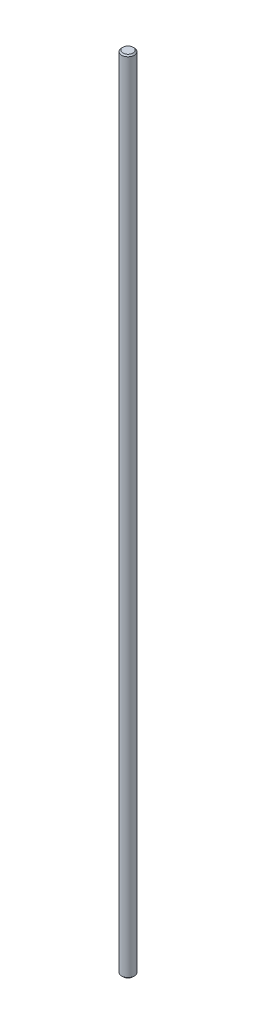
ISO-10303-21;
HEADER;
FILE_DESCRIPTION(('STEP AP214'),'2;1');
FILE_NAME('part.step','',(''),(''),'','','');
FILE_SCHEMA(('AUTOMOTIVE_DESIGN { 1 0 10303 214 1 1 1 1 }'));
ENDSEC;
DATA;
#1=APPLICATION_CONTEXT('core data for automotive mechanical design processes');
#2=APPLICATION_PROTOCOL_DEFINITION('international standard','automotive_design',2000,#1);
#3=PRODUCT_CONTEXT('',#1,'mechanical');
#4=PRODUCT('Part','Part','',(#3));
#5=PRODUCT_RELATED_PRODUCT_CATEGORY('part','',(#4));
#6=PRODUCT_DEFINITION_FORMATION('','',#4);
#7=PRODUCT_DEFINITION_CONTEXT('part definition',#1,'design');
#8=PRODUCT_DEFINITION('design','',#6,#7);
#9=PRODUCT_DEFINITION_SHAPE('','',#8);
#10=(LENGTH_UNIT() NAMED_UNIT(*) SI_UNIT(.MILLI.,.METRE.));
#11=(NAMED_UNIT(*) PLANE_ANGLE_UNIT() SI_UNIT($,.RADIAN.));
#12=(NAMED_UNIT(*) SI_UNIT($,.STERADIAN.) SOLID_ANGLE_UNIT());
#13=UNCERTAINTY_MEASURE_WITH_UNIT(LENGTH_MEASURE(1.E-05),#10,'distance_accuracy_value','');
#14=(GEOMETRIC_REPRESENTATION_CONTEXT(3) GLOBAL_UNCERTAINTY_ASSIGNED_CONTEXT((#13)) GLOBAL_UNIT_ASSIGNED_CONTEXT((#10,
#11,#12)) REPRESENTATION_CONTEXT('',''));
#15=CARTESIAN_POINT('',(0.,0.,0.));
#16=DIRECTION('',(0.,0.,1.));
#17=DIRECTION('',(1.,0.,0.));
#18=AXIS2_PLACEMENT_3D('',#15,#16,#17);
#19=CARTESIAN_POINT('',(0.,157.5,0.));
#20=DIRECTION('',(0.,-1.,0.));
#21=DIRECTION('',(0.,0.,-1.));
#22=AXIS2_PLACEMENT_3D('',#19,#20,#21);
#23=CYLINDRICAL_SURFACE('',#22,2.5);
#24=CARTESIAN_POINT('',(0.,-157.,0.));
#25=DIRECTION('',(0.,1.,0.));
#26=DIRECTION('',(0.,0.,1.));
#27=AXIS2_PLACEMENT_3D('',#24,#25,#26);
#28=CIRCLE('',#27,2.5);
#29=CARTESIAN_POINT('',(0.,-157.,2.5));
#30=VERTEX_POINT('',#29);
#31=EDGE_CURVE('E45',#30,#30,#28,.T.);
#32=ORIENTED_EDGE('',*,*,#31,.T.);
#33=EDGE_LOOP('',(#32));
#34=FACE_BOUND('',#33,.T.);
#35=CARTESIAN_POINT('',(0.,157.,0.));
#36=DIRECTION('',(0.,1.,0.));
#37=DIRECTION('',(0.,0.,1.));
#38=AXIS2_PLACEMENT_3D('',#35,#36,#37);
#39=CIRCLE('',#38,2.5);
#40=CARTESIAN_POINT('',(0.,157.,2.5));
#41=VERTEX_POINT('',#40);
#42=EDGE_CURVE('E49',#41,#41,#39,.F.);
#43=ORIENTED_EDGE('',*,*,#42,.T.);
#44=EDGE_LOOP('',(#43));
#45=FACE_BOUND('',#44,.T.);
#46=ADVANCED_FACE('F34',(#34,#45),#23,.T.);
#47=CARTESIAN_POINT('',(0.,157.5,0.));
#48=DIRECTION('',(0.,1.,0.));
#49=DIRECTION('',(0.,0.,1.));
#50=AXIS2_PLACEMENT_3D('',#47,#48,#49);
#51=PLANE('',#50);
#52=CARTESIAN_POINT('',(0.,157.5,0.));
#53=DIRECTION('',(0.,1.,0.));
#54=DIRECTION('',(0.,0.,1.));
#55=AXIS2_PLACEMENT_3D('',#52,#53,#54);
#56=CIRCLE('',#55,1.99999999999997);
#57=CARTESIAN_POINT('',(0.,157.5,1.99999999999997));
#58=VERTEX_POINT('',#57);
#59=EDGE_CURVE('E10',#58,#58,#56,.T.);
#60=ORIENTED_EDGE('',*,*,#59,.T.);
#61=EDGE_LOOP('',(#60));
#62=FACE_BOUND('',#61,.T.);
#63=ADVANCED_FACE('F65',(#62),#51,.T.);
#64=CARTESIAN_POINT('',(0.,-157.5,0.));
#65=DIRECTION('',(0.,1.,0.));
#66=DIRECTION('',(0.,0.,1.));
#67=AXIS2_PLACEMENT_3D('',#64,#65,#66);
#68=PLANE('',#67);
#69=CARTESIAN_POINT('',(0.,-157.5,0.));
#70=DIRECTION('',(0.,1.,0.));
#71=DIRECTION('',(0.,0.,1.));
#72=AXIS2_PLACEMENT_3D('',#69,#70,#71);
#73=CIRCLE('',#72,2.);
#74=CARTESIAN_POINT('',(0.,-157.5,2.));
#75=VERTEX_POINT('',#74);
#76=EDGE_CURVE('E41',#75,#75,#73,.F.);
#77=ORIENTED_EDGE('',*,*,#76,.T.);
#78=EDGE_LOOP('',(#77));
#79=FACE_BOUND('',#78,.T.);
#80=ADVANCED_FACE('F62',(#79),#68,.F.);
#81=CARTESIAN_POINT('',(0.,-157.,0.));
#82=DIRECTION('',(0.,1.,0.));
#83=DIRECTION('',(0.,0.,1.));
#84=AXIS2_PLACEMENT_3D('',#81,#82,#83);
#85=CONICAL_SURFACE('',#84,2.5,0.785398163397446);
#86=ORIENTED_EDGE('',*,*,#76,.F.);
#87=EDGE_LOOP('',(#86));
#88=FACE_BOUND('',#87,.T.);
#89=ORIENTED_EDGE('',*,*,#31,.F.);
#90=EDGE_LOOP('',(#89));
#91=FACE_BOUND('',#90,.T.);
#92=ADVANCED_FACE('F58',(#88,#91),#85,.T.);
#93=CARTESIAN_POINT('',(0.,157.5,0.));
#94=DIRECTION('',(0.,-1.,0.));
#95=DIRECTION('',(0.,0.,-1.));
#96=AXIS2_PLACEMENT_3D('',#93,#94,#95);
#97=CONICAL_SURFACE('',#96,1.99999999999997,0.785398163397446);
#98=ORIENTED_EDGE('',*,*,#42,.F.);
#99=EDGE_LOOP('',(#98));
#100=FACE_BOUND('',#99,.T.);
#101=ORIENTED_EDGE('',*,*,#59,.F.);
#102=EDGE_LOOP('',(#101));
#103=FACE_BOUND('',#102,.T.);
#104=ADVANCED_FACE('F36',(#100,#103),#97,.T.);
#105=CLOSED_SHELL('',(#46,#63,#80,#92,#104));
#106=MANIFOLD_SOLID_BREP('B2',#105);
#107=ADVANCED_BREP_SHAPE_REPRESENTATION('',(#18,#106),#14);
#108=SHAPE_DEFINITION_REPRESENTATION(#9,#107);
ENDSEC;
END-ISO-10303-21;
